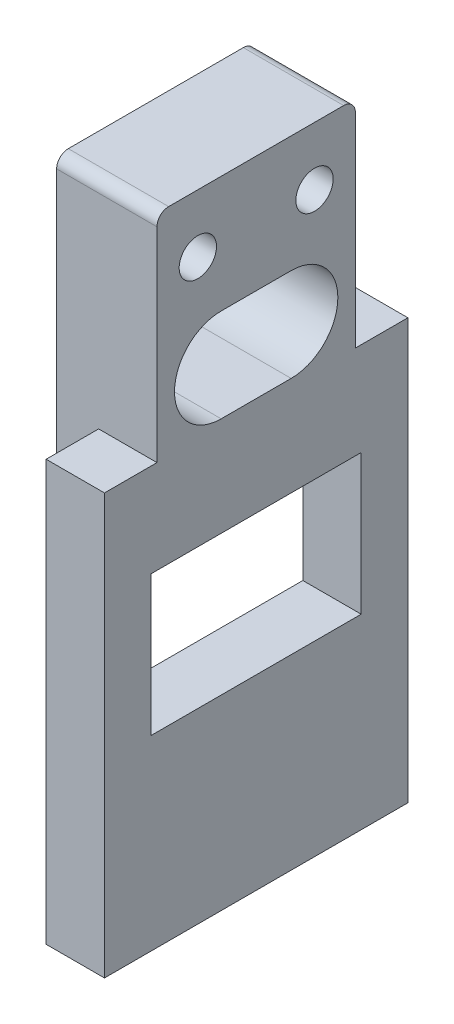
ISO-10303-21;
HEADER;
FILE_DESCRIPTION(('STEP AP214'),'2;1');
FILE_NAME('part.step','',(''),(''),'','','');
FILE_SCHEMA(('AUTOMOTIVE_DESIGN { 1 0 10303 214 1 1 1 1 }'));
ENDSEC;
DATA;
#1=APPLICATION_CONTEXT('core data for automotive mechanical design processes');
#2=APPLICATION_PROTOCOL_DEFINITION('international standard','automotive_design',2000,#1);
#3=PRODUCT_CONTEXT('',#1,'mechanical');
#4=PRODUCT('Part','Part','',(#3));
#5=PRODUCT_RELATED_PRODUCT_CATEGORY('part','',(#4));
#6=PRODUCT_DEFINITION_FORMATION('','',#4);
#7=PRODUCT_DEFINITION_CONTEXT('part definition',#1,'design');
#8=PRODUCT_DEFINITION('design','',#6,#7);
#9=PRODUCT_DEFINITION_SHAPE('','',#8);
#10=(LENGTH_UNIT() NAMED_UNIT(*) SI_UNIT(.MILLI.,.METRE.));
#11=(NAMED_UNIT(*) PLANE_ANGLE_UNIT() SI_UNIT($,.RADIAN.));
#12=(NAMED_UNIT(*) SI_UNIT($,.STERADIAN.) SOLID_ANGLE_UNIT());
#13=UNCERTAINTY_MEASURE_WITH_UNIT(LENGTH_MEASURE(1.E-05),#10,'distance_accuracy_value','');
#14=(GEOMETRIC_REPRESENTATION_CONTEXT(3) GLOBAL_UNCERTAINTY_ASSIGNED_CONTEXT((#13)) GLOBAL_UNIT_ASSIGNED_CONTEXT((#10,
#11,#12)) REPRESENTATION_CONTEXT('',''));
#15=CARTESIAN_POINT('',(0.,0.,0.));
#16=DIRECTION('',(0.,0.,1.));
#17=DIRECTION('',(1.,0.,0.));
#18=AXIS2_PLACEMENT_3D('',#15,#16,#17);
#19=CARTESIAN_POINT('',(3.60000000000001,27.5,0.));
#20=DIRECTION('',(0.,1.,0.));
#21=DIRECTION('',(0.,0.,1.));
#22=AXIS2_PLACEMENT_3D('',#19,#20,#21);
#23=PLANE('',#22);
#24=DIRECTION('',(0.,0.,1.));
#25=VECTOR('',#24,1.);
#26=CARTESIAN_POINT('',(8.6,27.5,0.));
#27=LINE('',#26,#25);
#28=CARTESIAN_POINT('',(8.60000000000001,27.5,8.5));
#29=VERTEX_POINT('',#28);
#30=CARTESIAN_POINT('',(8.6,27.5,13.));
#31=VERTEX_POINT('',#30);
#32=EDGE_CURVE('E350',#29,#31,#27,.T.);
#33=ORIENTED_EDGE('',*,*,#32,.F.);
#34=DIRECTION('',(-1.,0.,0.));
#35=VECTOR('',#34,1.);
#36=CARTESIAN_POINT('',(8.60000000000001,27.5,8.5));
#37=LINE('',#36,#35);
#38=CARTESIAN_POINT('',(3.60000000000001,27.5,8.5));
#39=VERTEX_POINT('',#38);
#40=EDGE_CURVE('E278',#29,#39,#37,.T.);
#41=ORIENTED_EDGE('',*,*,#40,.T.);
#42=DIRECTION('',(0.,0.,1.));
#43=VECTOR('',#42,1.);
#44=CARTESIAN_POINT('',(3.60000000000001,27.5,0.));
#45=LINE('',#44,#43);
#46=CARTESIAN_POINT('',(3.60000000000001,27.5,13.));
#47=VERTEX_POINT('',#46);
#48=EDGE_CURVE('E318',#39,#47,#45,.T.);
#49=ORIENTED_EDGE('',*,*,#48,.T.);
#50=DIRECTION('',(1.,0.,0.));
#51=VECTOR('',#50,1.);
#52=CARTESIAN_POINT('',(3.60000000000001,27.5,13.));
#53=LINE('',#52,#51);
#54=EDGE_CURVE('E399',#47,#31,#53,.T.);
#55=ORIENTED_EDGE('',*,*,#54,.T.);
#56=EDGE_LOOP('',(#33,#41,#49,#55));
#57=FACE_BOUND('',#56,.T.);
#58=ADVANCED_FACE('F45',(#57),#23,.T.);
#59=CARTESIAN_POINT('',(3.60000000000001,19.5,0.));
#60=DIRECTION('',(0.,1.,0.));
#61=DIRECTION('',(0.,0.,1.));
#62=AXIS2_PLACEMENT_3D('',#59,#60,#61);
#63=PLANE('',#62);
#64=DIRECTION('',(0.,0.,1.));
#65=VECTOR('',#64,1.);
#66=CARTESIAN_POINT('',(8.6,19.5,0.));
#67=LINE('',#66,#65);
#68=CARTESIAN_POINT('',(8.6,19.5,-8.99999999999999));
#69=VERTEX_POINT('',#68);
#70=CARTESIAN_POINT('',(8.6,19.5,9.00000000000002));
#71=VERTEX_POINT('',#70);
#72=EDGE_CURVE('E362',#69,#71,#67,.T.);
#73=ORIENTED_EDGE('',*,*,#72,.T.);
#74=DIRECTION('',(1.,0.,0.));
#75=VECTOR('',#74,1.);
#76=CARTESIAN_POINT('',(3.60000000000001,19.5,9.00000000000002));
#77=LINE('',#76,#75);
#78=CARTESIAN_POINT('',(3.60000000000001,19.5,9.00000000000002));
#79=VERTEX_POINT('',#78);
#80=EDGE_CURVE('E377',#79,#71,#77,.T.);
#81=ORIENTED_EDGE('',*,*,#80,.F.);
#82=DIRECTION('',(0.,0.,1.));
#83=VECTOR('',#82,1.);
#84=CARTESIAN_POINT('',(3.60000000000001,19.5,0.));
#85=LINE('',#84,#83);
#86=CARTESIAN_POINT('',(3.60000000000001,19.5,-8.99999999999999));
#87=VERTEX_POINT('',#86);
#88=EDGE_CURVE('E331',#87,#79,#85,.T.);
#89=ORIENTED_EDGE('',*,*,#88,.F.);
#90=DIRECTION('',(1.,0.,0.));
#91=VECTOR('',#90,1.);
#92=CARTESIAN_POINT('',(3.60000000000001,19.5,-8.99999999999999));
#93=LINE('',#92,#91);
#94=EDGE_CURVE('E388',#87,#69,#93,.T.);
#95=ORIENTED_EDGE('',*,*,#94,.T.);
#96=EDGE_LOOP('',(#73,#81,#89,#95));
#97=FACE_BOUND('',#96,.T.);
#98=ADVANCED_FACE('F510',(#97),#63,.F.);
#99=CARTESIAN_POINT('',(3.60000000000001,0.,9.00000000000002));
#100=DIRECTION('',(0.,0.,1.));
#101=DIRECTION('',(0.,-1.,0.));
#102=AXIS2_PLACEMENT_3D('',#99,#100,#101);
#103=PLANE('',#102);
#104=DIRECTION('',(0.,-1.,0.));
#105=VECTOR('',#104,1.);
#106=CARTESIAN_POINT('',(8.6,0.,9.00000000000002));
#107=LINE('',#106,#105);
#108=CARTESIAN_POINT('',(8.6,7.50000000000001,9.00000000000002));
#109=VERTEX_POINT('',#108);
#110=EDGE_CURVE('E319',#71,#109,#107,.T.);
#111=ORIENTED_EDGE('',*,*,#110,.T.);
#112=DIRECTION('',(1.,0.,0.));
#113=VECTOR('',#112,1.);
#114=CARTESIAN_POINT('',(3.60000000000001,7.50000000000001,9.00000000000002));
#115=LINE('',#114,#113);
#116=CARTESIAN_POINT('',(3.60000000000001,7.50000000000001,9.00000000000002));
#117=VERTEX_POINT('',#116);
#118=EDGE_CURVE('E382',#117,#109,#115,.T.);
#119=ORIENTED_EDGE('',*,*,#118,.F.);
#120=DIRECTION('',(0.,-1.,0.));
#121=VECTOR('',#120,1.);
#122=CARTESIAN_POINT('',(3.60000000000001,0.,9.00000000000002));
#123=LINE('',#122,#121);
#124=EDGE_CURVE('E343',#79,#117,#123,.T.);
#125=ORIENTED_EDGE('',*,*,#124,.F.);
#126=ORIENTED_EDGE('',*,*,#80,.T.);
#127=EDGE_LOOP('',(#111,#119,#125,#126));
#128=FACE_BOUND('',#127,.T.);
#129=ADVANCED_FACE('F515',(#128),#103,.F.);
#130=CARTESIAN_POINT('',(3.60000000000001,7.50000000000001,0.));
#131=DIRECTION('',(0.,1.,0.));
#132=DIRECTION('',(0.,0.,1.));
#133=AXIS2_PLACEMENT_3D('',#130,#131,#132);
#134=PLANE('',#133);
#135=DIRECTION('',(0.,0.,1.));
#136=VECTOR('',#135,1.);
#137=CARTESIAN_POINT('',(8.6,7.50000000000001,0.));
#138=LINE('',#137,#136);
#139=CARTESIAN_POINT('',(8.6,7.50000000000001,-8.99999999999999));
#140=VERTEX_POINT('',#139);
#141=EDGE_CURVE('E370',#140,#109,#138,.T.);
#142=ORIENTED_EDGE('',*,*,#141,.F.);
#143=DIRECTION('',(1.,0.,0.));
#144=VECTOR('',#143,1.);
#145=CARTESIAN_POINT('',(3.60000000000001,7.50000000000001,-8.99999999999999));
#146=LINE('',#145,#144);
#147=CARTESIAN_POINT('',(3.60000000000001,7.50000000000001,-8.99999999999999));
#148=VERTEX_POINT('',#147);
#149=EDGE_CURVE('E385',#148,#140,#146,.T.);
#150=ORIENTED_EDGE('',*,*,#149,.F.);
#151=DIRECTION('',(0.,0.,1.));
#152=VECTOR('',#151,1.);
#153=CARTESIAN_POINT('',(3.60000000000001,7.50000000000001,0.));
#154=LINE('',#153,#152);
#155=EDGE_CURVE('E339',#148,#117,#154,.T.);
#156=ORIENTED_EDGE('',*,*,#155,.T.);
#157=ORIENTED_EDGE('',*,*,#118,.T.);
#158=EDGE_LOOP('',(#142,#150,#156,#157));
#159=FACE_BOUND('',#158,.T.);
#160=ADVANCED_FACE('F533',(#159),#134,.T.);
#161=CARTESIAN_POINT('',(3.60000000000001,0.,-13.));
#162=DIRECTION('',(0.,0.,1.));
#163=DIRECTION('',(0.,-1.,0.));
#164=AXIS2_PLACEMENT_3D('',#161,#162,#163);
#165=PLANE('',#164);
#166=DIRECTION('',(0.,-1.,0.));
#167=VECTOR('',#166,1.);
#168=CARTESIAN_POINT('',(8.6,0.,-13.));
#169=LINE('',#168,#167);
#170=CARTESIAN_POINT('',(8.6,27.5,-13.));
#171=VERTEX_POINT('',#170);
#172=CARTESIAN_POINT('',(8.6,-8.49999999999999,-13.));
#173=VERTEX_POINT('',#172);
#174=EDGE_CURVE('E313',#171,#173,#169,.T.);
#175=ORIENTED_EDGE('',*,*,#174,.T.);
#176=DIRECTION('',(1.,0.,0.));
#177=VECTOR('',#176,1.);
#178=CARTESIAN_POINT('',(3.60000000000001,-8.49999999999999,-13.));
#179=LINE('',#178,#177);
#180=CARTESIAN_POINT('',(3.60000000000001,-8.49999999999999,-13.));
#181=VERTEX_POINT('',#180);
#182=EDGE_CURVE('E391',#181,#173,#179,.T.);
#183=ORIENTED_EDGE('',*,*,#182,.F.);
#184=DIRECTION('',(0.,-1.,0.));
#185=VECTOR('',#184,1.);
#186=CARTESIAN_POINT('',(3.60000000000001,0.,-13.));
#187=LINE('',#186,#185);
#188=CARTESIAN_POINT('',(3.60000000000001,27.5,-13.));
#189=VERTEX_POINT('',#188);
#190=EDGE_CURVE('E314',#189,#181,#187,.T.);
#191=ORIENTED_EDGE('',*,*,#190,.F.);
#192=DIRECTION('',(1.,0.,0.));
#193=VECTOR('',#192,1.);
#194=CARTESIAN_POINT('',(3.60000000000001,27.5,-13.));
#195=LINE('',#194,#193);
#196=EDGE_CURVE('E346',#189,#171,#195,.T.);
#197=ORIENTED_EDGE('',*,*,#196,.T.);
#198=EDGE_LOOP('',(#175,#183,#191,#197));
#199=FACE_BOUND('',#198,.T.);
#200=ADVANCED_FACE('F497',(#199),#165,.F.);
#201=CARTESIAN_POINT('',(3.60000000000001,-8.49999999999999,0.));
#202=DIRECTION('',(0.,1.,0.));
#203=DIRECTION('',(0.,0.,1.));
#204=AXIS2_PLACEMENT_3D('',#201,#202,#203);
#205=PLANE('',#204);
#206=DIRECTION('',(0.,0.,1.));
#207=VECTOR('',#206,1.);
#208=CARTESIAN_POINT('',(8.6,-8.49999999999999,0.));
#209=LINE('',#208,#207);
#210=CARTESIAN_POINT('',(8.6,-8.49999999999998,13.));
#211=VERTEX_POINT('',#210);
#212=EDGE_CURVE('E359',#173,#211,#209,.T.);
#213=ORIENTED_EDGE('',*,*,#212,.T.);
#214=DIRECTION('',(1.,0.,0.));
#215=VECTOR('',#214,1.);
#216=CARTESIAN_POINT('',(3.60000000000001,-8.49999999999998,13.));
#217=LINE('',#216,#215);
#218=CARTESIAN_POINT('',(3.60000000000001,-8.49999999999998,13.));
#219=VERTEX_POINT('',#218);
#220=EDGE_CURVE('E395',#219,#211,#217,.T.);
#221=ORIENTED_EDGE('',*,*,#220,.F.);
#222=DIRECTION('',(0.,0.,1.));
#223=VECTOR('',#222,1.);
#224=CARTESIAN_POINT('',(3.60000000000001,-8.49999999999999,0.));
#225=LINE('',#224,#223);
#226=EDGE_CURVE('E328',#181,#219,#225,.T.);
#227=ORIENTED_EDGE('',*,*,#226,.F.);
#228=ORIENTED_EDGE('',*,*,#182,.T.);
#229=EDGE_LOOP('',(#213,#221,#227,#228));
#230=FACE_BOUND('',#229,.T.);
#231=ADVANCED_FACE('F499',(#230),#205,.F.);
#232=CARTESIAN_POINT('',(3.60000000000001,0.,13.));
#233=DIRECTION('',(0.,0.,-1.));
#234=DIRECTION('',(0.,1.,0.));
#235=AXIS2_PLACEMENT_3D('',#232,#233,#234);
#236=PLANE('',#235);
#237=DIRECTION('',(0.,1.,0.));
#238=VECTOR('',#237,1.);
#239=CARTESIAN_POINT('',(8.6,0.,13.));
#240=LINE('',#239,#238);
#241=EDGE_CURVE('E355',#211,#31,#240,.T.);
#242=ORIENTED_EDGE('',*,*,#241,.T.);
#243=ORIENTED_EDGE('',*,*,#54,.F.);
#244=DIRECTION('',(0.,1.,0.));
#245=VECTOR('',#244,1.);
#246=CARTESIAN_POINT('',(3.60000000000001,0.,13.));
#247=LINE('',#246,#245);
#248=EDGE_CURVE('E324',#219,#47,#247,.T.);
#249=ORIENTED_EDGE('',*,*,#248,.F.);
#250=ORIENTED_EDGE('',*,*,#220,.T.);
#251=EDGE_LOOP('',(#242,#243,#249,#250));
#252=FACE_BOUND('',#251,.T.);
#253=ADVANCED_FACE('F504',(#252),#236,.F.);
#254=DIRECTION('',(-1.,0.,0.));
#255=VECTOR('',#254,1.);
#256=CARTESIAN_POINT('',(8.60000000000001,27.5,-8.49999999999997));
#257=LINE('',#256,#255);
#258=CARTESIAN_POINT('',(8.60000000000001,27.5,-8.49999999999997));
#259=VERTEX_POINT('',#258);
#260=CARTESIAN_POINT('',(3.60000000000001,27.5,-8.49999999999997));
#261=VERTEX_POINT('',#260);
#262=EDGE_CURVE('E274',#259,#261,#257,.T.);
#263=ORIENTED_EDGE('',*,*,#262,.F.);
#264=EDGE_CURVE('E351',#171,#259,#27,.T.);
#265=ORIENTED_EDGE('',*,*,#264,.F.);
#266=ORIENTED_EDGE('',*,*,#196,.F.);
#267=EDGE_CURVE('E320',#189,#261,#45,.T.);
#268=ORIENTED_EDGE('',*,*,#267,.T.);
#269=EDGE_LOOP('',(#263,#265,#266,#268));
#270=FACE_BOUND('',#269,.T.);
#271=ADVANCED_FACE('F492',(#270),#23,.T.);
#272=CARTESIAN_POINT('',(3.60000000000001,0.,-8.99999999999999));
#273=DIRECTION('',(0.,0.,1.));
#274=DIRECTION('',(0.,-1.,0.));
#275=AXIS2_PLACEMENT_3D('',#272,#273,#274);
#276=PLANE('',#275);
#277=DIRECTION('',(0.,-1.,0.));
#278=VECTOR('',#277,1.);
#279=CARTESIAN_POINT('',(8.6,0.,-8.99999999999999));
#280=LINE('',#279,#278);
#281=EDGE_CURVE('E366',#69,#140,#280,.T.);
#282=ORIENTED_EDGE('',*,*,#281,.F.);
#283=ORIENTED_EDGE('',*,*,#94,.F.);
#284=DIRECTION('',(0.,-1.,0.));
#285=VECTOR('',#284,1.);
#286=CARTESIAN_POINT('',(3.60000000000001,0.,-8.99999999999999));
#287=LINE('',#286,#285);
#288=EDGE_CURVE('E335',#87,#148,#287,.T.);
#289=ORIENTED_EDGE('',*,*,#288,.T.);
#290=ORIENTED_EDGE('',*,*,#149,.T.);
#291=EDGE_LOOP('',(#282,#283,#289,#290));
#292=FACE_BOUND('',#291,.T.);
#293=ADVANCED_FACE('F521',(#292),#276,.T.);
#294=CARTESIAN_POINT('',(3.60000000000001,0.,0.));
#295=DIRECTION('',(1.,0.,0.));
#296=DIRECTION('',(0.,0.,-1.));
#297=AXIS2_PLACEMENT_3D('',#294,#295,#296);
#298=PLANE('',#297);
#299=ORIENTED_EDGE('',*,*,#48,.F.);
#300=DIRECTION('',(0.,-1.,0.));
#301=VECTOR('',#300,1.);
#302=CARTESIAN_POINT('',(3.60000000000001,0.,8.5));
#303=LINE('',#302,#301);
#304=CARTESIAN_POINT('',(3.60000000000001,23.5,8.5));
#305=VERTEX_POINT('',#304);
#306=EDGE_CURVE('E310',#39,#305,#303,.T.);
#307=ORIENTED_EDGE('',*,*,#306,.T.);
#308=CARTESIAN_POINT('',(3.60000000000001,23.5,7.5));
#309=DIRECTION('',(1.,0.,0.));
#310=DIRECTION('',(0.,0.,-1.));
#311=AXIS2_PLACEMENT_3D('',#308,#309,#310);
#312=CIRCLE('',#311,1.);
#313=CARTESIAN_POINT('',(3.60000000000001,22.5,7.5));
#314=VERTEX_POINT('',#313);
#315=EDGE_CURVE('E11',#305,#314,#312,.T.);
#316=ORIENTED_EDGE('',*,*,#315,.T.);
#317=DIRECTION('',(0.,0.,-1.));
#318=VECTOR('',#317,1.);
#319=CARTESIAN_POINT('',(3.60000000000001,22.5,0.));
#320=LINE('',#319,#318);
#321=CARTESIAN_POINT('',(3.60000000000001,22.5,-7.49999999999997));
#322=VERTEX_POINT('',#321);
#323=EDGE_CURVE('E307',#314,#322,#320,.T.);
#324=ORIENTED_EDGE('',*,*,#323,.T.);
#325=CARTESIAN_POINT('',(3.60000000000001,23.5,-7.49999999999997));
#326=DIRECTION('',(1.,0.,0.));
#327=DIRECTION('',(0.,0.,-1.));
#328=AXIS2_PLACEMENT_3D('',#325,#326,#327);
#329=CIRCLE('',#328,1.);
#330=CARTESIAN_POINT('',(3.60000000000001,23.5,-8.49999999999997));
#331=VERTEX_POINT('',#330);
#332=EDGE_CURVE('E54',#322,#331,#329,.T.);
#333=ORIENTED_EDGE('',*,*,#332,.T.);
#334=DIRECTION('',(0.,1.,0.));
#335=VECTOR('',#334,1.);
#336=CARTESIAN_POINT('',(3.60000000000001,0.,-8.49999999999996));
#337=LINE('',#336,#335);
#338=EDGE_CURVE('E304',#331,#261,#337,.T.);
#339=ORIENTED_EDGE('',*,*,#338,.T.);
#340=ORIENTED_EDGE('',*,*,#267,.F.);
#341=ORIENTED_EDGE('',*,*,#190,.T.);
#342=ORIENTED_EDGE('',*,*,#226,.T.);
#343=ORIENTED_EDGE('',*,*,#248,.T.);
#344=EDGE_LOOP('',(#299,#307,#316,#324,#333,#339,#340,#341,#342,#343));
#345=FACE_BOUND('',#344,.T.);
#346=ORIENTED_EDGE('',*,*,#88,.T.);
#347=ORIENTED_EDGE('',*,*,#124,.T.);
#348=ORIENTED_EDGE('',*,*,#155,.F.);
#349=ORIENTED_EDGE('',*,*,#288,.F.);
#350=EDGE_LOOP('',(#346,#347,#348,#349));
#351=FACE_BOUND('',#350,.T.);
#352=ADVANCED_FACE('F452',(#345,#351),#298,.F.);
#353=CARTESIAN_POINT('',(8.6,0.,0.));
#354=DIRECTION('',(1.,0.,0.));
#355=DIRECTION('',(0.,0.,-1.));
#356=AXIS2_PLACEMENT_3D('',#353,#354,#355);
#357=PLANE('',#356);
#358=CARTESIAN_POINT('',(8.6,41.,5.00000000000001));
#359=DIRECTION('',(1.,0.,0.));
#360=DIRECTION('',(0.,0.,-1.));
#361=AXIS2_PLACEMENT_3D('',#358,#359,#360);
#362=CIRCLE('',#361,1.59999999999999);
#363=CARTESIAN_POINT('',(8.6,41.,3.40000000000002));
#364=VERTEX_POINT('',#363);
#365=EDGE_CURVE('E214',#364,#364,#362,.T.);
#366=ORIENTED_EDGE('',*,*,#365,.F.);
#367=EDGE_LOOP('',(#366));
#368=FACE_BOUND('',#367,.T.);
#369=CARTESIAN_POINT('',(8.6,41.,-4.99999999999999));
#370=DIRECTION('',(1.,0.,0.));
#371=DIRECTION('',(0.,0.,-1.));
#372=AXIS2_PLACEMENT_3D('',#369,#370,#371);
#373=CIRCLE('',#372,1.59999999999999);
#374=CARTESIAN_POINT('',(8.6,41.,-6.59999999999998));
#375=VERTEX_POINT('',#374);
#376=EDGE_CURVE('E213',#375,#375,#373,.T.);
#377=ORIENTED_EDGE('',*,*,#376,.F.);
#378=EDGE_LOOP('',(#377));
#379=FACE_BOUND('',#378,.T.);
#380=DIRECTION('',(0.,-1.,0.));
#381=VECTOR('',#380,1.);
#382=CARTESIAN_POINT('',(8.60000000000001,0.,-8.49999999999996));
#383=LINE('',#382,#381);
#384=CARTESIAN_POINT('',(8.60000000000001,45.,-8.49999999999997));
#385=VERTEX_POINT('',#384);
#386=EDGE_CURVE('E252',#385,#259,#383,.T.);
#387=ORIENTED_EDGE('',*,*,#386,.F.);
#388=CARTESIAN_POINT('',(8.6,45.,-7.49999999999997));
#389=DIRECTION('',(1.,0.,0.));
#390=DIRECTION('',(0.,0.,-1.));
#391=AXIS2_PLACEMENT_3D('',#388,#389,#390);
#392=CIRCLE('',#391,1.);
#393=CARTESIAN_POINT('',(8.60000000000001,46.,-7.49999999999997));
#394=VERTEX_POINT('',#393);
#395=EDGE_CURVE('E433',#385,#394,#392,.T.);
#396=ORIENTED_EDGE('',*,*,#395,.T.);
#397=DIRECTION('',(0.,0.,-1.));
#398=VECTOR('',#397,1.);
#399=CARTESIAN_POINT('',(8.60000000000001,46.,0.));
#400=LINE('',#399,#398);
#401=CARTESIAN_POINT('',(8.60000000000001,46.,7.5));
#402=VERTEX_POINT('',#401);
#403=EDGE_CURVE('E244',#402,#394,#400,.T.);
#404=ORIENTED_EDGE('',*,*,#403,.F.);
#405=CARTESIAN_POINT('',(8.6,45.,7.5));
#406=DIRECTION('',(1.,0.,0.));
#407=DIRECTION('',(0.,0.,-1.));
#408=AXIS2_PLACEMENT_3D('',#405,#406,#407);
#409=CIRCLE('',#408,1.);
#410=CARTESIAN_POINT('',(8.60000000000001,45.,8.5));
#411=VERTEX_POINT('',#410);
#412=EDGE_CURVE('E430',#402,#411,#409,.T.);
#413=ORIENTED_EDGE('',*,*,#412,.T.);
#414=DIRECTION('',(0.,1.,0.));
#415=VECTOR('',#414,1.);
#416=CARTESIAN_POINT('',(8.60000000000001,0.,8.5));
#417=LINE('',#416,#415);
#418=EDGE_CURVE('E248',#29,#411,#417,.T.);
#419=ORIENTED_EDGE('',*,*,#418,.F.);
#420=ORIENTED_EDGE('',*,*,#32,.T.);
#421=ORIENTED_EDGE('',*,*,#241,.F.);
#422=ORIENTED_EDGE('',*,*,#212,.F.);
#423=ORIENTED_EDGE('',*,*,#174,.F.);
#424=ORIENTED_EDGE('',*,*,#264,.T.);
#425=EDGE_LOOP('',(#387,#396,#404,#413,#419,#420,#421,#422,#423,#424));
#426=FACE_BOUND('',#425,.T.);
#427=ORIENTED_EDGE('',*,*,#72,.F.);
#428=ORIENTED_EDGE('',*,*,#281,.T.);
#429=ORIENTED_EDGE('',*,*,#141,.T.);
#430=ORIENTED_EDGE('',*,*,#110,.F.);
#431=EDGE_LOOP('',(#427,#428,#429,#430));
#432=FACE_BOUND('',#431,.T.);
#433=CARTESIAN_POINT('',(8.60000000000001,32.,3.00000000000001));
#434=DIRECTION('',(1.,0.,0.));
#435=DIRECTION('',(0.,0.,-1.));
#436=AXIS2_PLACEMENT_3D('',#433,#434,#435);
#437=CIRCLE('',#436,4.);
#438=CARTESIAN_POINT('',(8.60000000000001,36.,3.00000000000001));
#439=VERTEX_POINT('',#438);
#440=CARTESIAN_POINT('',(8.60000000000001,28.,3.00000000000001));
#441=VERTEX_POINT('',#440);
#442=EDGE_CURVE('E228',#439,#441,#437,.T.);
#443=ORIENTED_EDGE('',*,*,#442,.F.);
#444=DIRECTION('',(0.,0.,-1.));
#445=VECTOR('',#444,1.);
#446=CARTESIAN_POINT('',(8.60000000000001,36.,0.));
#447=LINE('',#446,#445);
#448=CARTESIAN_POINT('',(8.60000000000001,36.,-2.99999999999999));
#449=VERTEX_POINT('',#448);
#450=EDGE_CURVE('E232',#439,#449,#447,.T.);
#451=ORIENTED_EDGE('',*,*,#450,.T.);
#452=CARTESIAN_POINT('',(8.60000000000001,32.,-2.99999999999999));
#453=DIRECTION('',(1.,0.,0.));
#454=DIRECTION('',(0.,0.,-1.));
#455=AXIS2_PLACEMENT_3D('',#452,#453,#454);
#456=CIRCLE('',#455,4.);
#457=CARTESIAN_POINT('',(8.60000000000001,28.,-2.99999999999999));
#458=VERTEX_POINT('',#457);
#459=EDGE_CURVE('E236',#458,#449,#456,.T.);
#460=ORIENTED_EDGE('',*,*,#459,.F.);
#461=DIRECTION('',(0.,0.,-1.));
#462=VECTOR('',#461,1.);
#463=CARTESIAN_POINT('',(8.60000000000001,28.,0.));
#464=LINE('',#463,#462);
#465=EDGE_CURVE('E240',#441,#458,#464,.T.);
#466=ORIENTED_EDGE('',*,*,#465,.F.);
#467=EDGE_LOOP('',(#443,#451,#460,#466));
#468=FACE_BOUND('',#467,.T.);
#469=ADVANCED_FACE('F487',(#368,#379,#426,#432,#468),#357,.T.);
#470=CARTESIAN_POINT('',(8.60000000000001,0.,8.5));
#471=DIRECTION('',(0.,0.,1.));
#472=DIRECTION('',(1.,0.,0.));
#473=AXIS2_PLACEMENT_3D('',#470,#471,#472);
#474=PLANE('',#473);
#475=DIRECTION('',(0.,1.,0.));
#476=VECTOR('',#475,1.);
#477=CARTESIAN_POINT('',(0.,0.,8.5));
#478=LINE('',#477,#476);
#479=CARTESIAN_POINT('',(0.,23.5,8.5));
#480=VERTEX_POINT('',#479);
#481=CARTESIAN_POINT('',(0.,45.,8.5));
#482=VERTEX_POINT('',#481);
#483=EDGE_CURVE('E282',#480,#482,#478,.T.);
#484=ORIENTED_EDGE('',*,*,#483,.F.);
#485=DIRECTION('',(-1.,0.,0.));
#486=VECTOR('',#485,1.);
#487=CARTESIAN_POINT('',(8.60000000000001,23.5,8.5));
#488=LINE('',#487,#486);
#489=EDGE_CURVE('E61',#480,#305,#488,.F.);
#490=ORIENTED_EDGE('',*,*,#489,.T.);
#491=ORIENTED_EDGE('',*,*,#306,.F.);
#492=ORIENTED_EDGE('',*,*,#40,.F.);
#493=ORIENTED_EDGE('',*,*,#418,.T.);
#494=DIRECTION('',(-1.,0.,0.));
#495=VECTOR('',#494,1.);
#496=CARTESIAN_POINT('',(8.60000000000001,45.,8.5));
#497=LINE('',#496,#495);
#498=EDGE_CURVE('E442',#411,#482,#497,.T.);
#499=ORIENTED_EDGE('',*,*,#498,.T.);
#500=EDGE_LOOP('',(#484,#490,#491,#492,#493,#499));
#501=FACE_BOUND('',#500,.T.);
#502=ADVANCED_FACE('F470',(#501),#474,.T.);
#503=CARTESIAN_POINT('',(8.60000000000001,22.5,0.));
#504=DIRECTION('',(0.,-1.,0.));
#505=DIRECTION('',(0.,0.,-1.));
#506=AXIS2_PLACEMENT_3D('',#503,#504,#505);
#507=PLANE('',#506);
#508=DIRECTION('',(0.,0.,1.));
#509=VECTOR('',#508,1.);
#510=CARTESIAN_POINT('',(0.,22.5,0.));
#511=LINE('',#510,#509);
#512=CARTESIAN_POINT('',(0.,22.5,-7.49999999999997));
#513=VERTEX_POINT('',#512);
#514=CARTESIAN_POINT('',(0.,22.5,7.5));
#515=VERTEX_POINT('',#514);
#516=EDGE_CURVE('E296',#513,#515,#511,.T.);
#517=ORIENTED_EDGE('',*,*,#516,.F.);
#518=DIRECTION('',(-1.,0.,0.));
#519=VECTOR('',#518,1.);
#520=CARTESIAN_POINT('',(8.60000000000001,22.5,-7.49999999999997));
#521=LINE('',#520,#519);
#522=EDGE_CURVE('E69',#513,#322,#521,.F.);
#523=ORIENTED_EDGE('',*,*,#522,.T.);
#524=ORIENTED_EDGE('',*,*,#323,.F.);
#525=DIRECTION('',(-1.,0.,0.));
#526=VECTOR('',#525,1.);
#527=CARTESIAN_POINT('',(8.60000000000001,22.5,7.5));
#528=LINE('',#527,#526);
#529=EDGE_CURVE('E436',#314,#515,#528,.T.);
#530=ORIENTED_EDGE('',*,*,#529,.T.);
#531=EDGE_LOOP('',(#517,#523,#524,#530));
#532=FACE_BOUND('',#531,.T.);
#533=ADVANCED_FACE('F465',(#532),#507,.T.);
#534=CARTESIAN_POINT('',(8.60000000000001,0.,-8.49999999999996));
#535=DIRECTION('',(0.,0.,-1.));
#536=DIRECTION('',(0.,1.,0.));
#537=AXIS2_PLACEMENT_3D('',#534,#535,#536);
#538=PLANE('',#537);
#539=DIRECTION('',(0.,-1.,0.));
#540=VECTOR('',#539,1.);
#541=CARTESIAN_POINT('',(0.,0.,-8.49999999999996));
#542=LINE('',#541,#540);
#543=CARTESIAN_POINT('',(0.,45.,-8.49999999999997));
#544=VERTEX_POINT('',#543);
#545=CARTESIAN_POINT('',(0.,23.5,-8.49999999999997));
#546=VERTEX_POINT('',#545);
#547=EDGE_CURVE('E300',#544,#546,#542,.T.);
#548=ORIENTED_EDGE('',*,*,#547,.F.);
#549=DIRECTION('',(-1.,0.,0.));
#550=VECTOR('',#549,1.);
#551=CARTESIAN_POINT('',(8.60000000000001,45.,-8.49999999999997));
#552=LINE('',#551,#550);
#553=EDGE_CURVE('E427',#544,#385,#552,.F.);
#554=ORIENTED_EDGE('',*,*,#553,.T.);
#555=ORIENTED_EDGE('',*,*,#386,.T.);
#556=ORIENTED_EDGE('',*,*,#262,.T.);
#557=ORIENTED_EDGE('',*,*,#338,.F.);
#558=DIRECTION('',(-1.,0.,0.));
#559=VECTOR('',#558,1.);
#560=CARTESIAN_POINT('',(8.60000000000001,23.5,-8.49999999999997));
#561=LINE('',#560,#559);
#562=EDGE_CURVE('E423',#331,#546,#561,.T.);
#563=ORIENTED_EDGE('',*,*,#562,.T.);
#564=EDGE_LOOP('',(#548,#554,#555,#556,#557,#563));
#565=FACE_BOUND('',#564,.T.);
#566=ADVANCED_FACE('F459',(#565),#538,.T.);
#567=CARTESIAN_POINT('',(0.,0.,0.));
#568=DIRECTION('',(1.,0.,0.));
#569=DIRECTION('',(0.,0.,-1.));
#570=AXIS2_PLACEMENT_3D('',#567,#568,#569);
#571=PLANE('',#570);
#572=DIRECTION('',(0.,0.,-1.));
#573=VECTOR('',#572,1.);
#574=CARTESIAN_POINT('',(0.,46.,0.));
#575=LINE('',#574,#573);
#576=CARTESIAN_POINT('',(0.,46.,7.5));
#577=VERTEX_POINT('',#576);
#578=CARTESIAN_POINT('',(0.,46.,-7.49999999999997));
#579=VERTEX_POINT('',#578);
#580=EDGE_CURVE('E233',#577,#579,#575,.T.);
#581=ORIENTED_EDGE('',*,*,#580,.T.);
#582=CARTESIAN_POINT('',(0.,45.,-7.49999999999997));
#583=DIRECTION('',(1.,0.,0.));
#584=DIRECTION('',(0.,0.,-1.));
#585=AXIS2_PLACEMENT_3D('',#582,#583,#584);
#586=CIRCLE('',#585,1.);
#587=EDGE_CURVE('E420',#579,#544,#586,.F.);
#588=ORIENTED_EDGE('',*,*,#587,.T.);
#589=ORIENTED_EDGE('',*,*,#547,.T.);
#590=CARTESIAN_POINT('',(0.,23.5,-7.49999999999997));
#591=DIRECTION('',(1.,0.,0.));
#592=DIRECTION('',(0.,0.,-1.));
#593=AXIS2_PLACEMENT_3D('',#590,#591,#592);
#594=CIRCLE('',#593,1.);
#595=EDGE_CURVE('E417',#546,#513,#594,.F.);
#596=ORIENTED_EDGE('',*,*,#595,.T.);
#597=ORIENTED_EDGE('',*,*,#516,.T.);
#598=CARTESIAN_POINT('',(0.,23.5,7.5));
#599=DIRECTION('',(1.,0.,0.));
#600=DIRECTION('',(0.,0.,-1.));
#601=AXIS2_PLACEMENT_3D('',#598,#599,#600);
#602=CIRCLE('',#601,1.);
#603=EDGE_CURVE('E414',#515,#480,#602,.F.);
#604=ORIENTED_EDGE('',*,*,#603,.T.);
#605=ORIENTED_EDGE('',*,*,#483,.T.);
#606=CARTESIAN_POINT('',(0.,45.,7.5));
#607=DIRECTION('',(1.,0.,0.));
#608=DIRECTION('',(0.,0.,-1.));
#609=AXIS2_PLACEMENT_3D('',#606,#607,#608);
#610=CIRCLE('',#609,1.);
#611=EDGE_CURVE('E411',#482,#577,#610,.F.);
#612=ORIENTED_EDGE('',*,*,#611,.T.);
#613=EDGE_LOOP('',(#581,#588,#589,#596,#597,#604,#605,#612));
#614=FACE_BOUND('',#613,.T.);
#615=CARTESIAN_POINT('',(0.,32.,3.00000000000001));
#616=DIRECTION('',(1.,0.,0.));
#617=DIRECTION('',(0.,0.,-1.));
#618=AXIS2_PLACEMENT_3D('',#615,#616,#617);
#619=CIRCLE('',#618,4.);
#620=CARTESIAN_POINT('',(0.,36.,3.00000000000001));
#621=VERTEX_POINT('',#620);
#622=CARTESIAN_POINT('',(0.,28.,3.00000000000001));
#623=VERTEX_POINT('',#622);
#624=EDGE_CURVE('E227',#621,#623,#619,.T.);
#625=ORIENTED_EDGE('',*,*,#624,.T.);
#626=DIRECTION('',(0.,0.,-1.));
#627=VECTOR('',#626,1.);
#628=CARTESIAN_POINT('',(0.,28.,0.));
#629=LINE('',#628,#627);
#630=CARTESIAN_POINT('',(0.,28.,-2.99999999999999));
#631=VERTEX_POINT('',#630);
#632=EDGE_CURVE('E267',#623,#631,#629,.T.);
#633=ORIENTED_EDGE('',*,*,#632,.T.);
#634=CARTESIAN_POINT('',(0.,32.,-2.99999999999999));
#635=DIRECTION('',(1.,0.,0.));
#636=DIRECTION('',(0.,0.,-1.));
#637=AXIS2_PLACEMENT_3D('',#634,#635,#636);
#638=CIRCLE('',#637,4.);
#639=CARTESIAN_POINT('',(0.,36.,-2.99999999999999));
#640=VERTEX_POINT('',#639);
#641=EDGE_CURVE('E263',#631,#640,#638,.T.);
#642=ORIENTED_EDGE('',*,*,#641,.T.);
#643=DIRECTION('',(0.,0.,-1.));
#644=VECTOR('',#643,1.);
#645=CARTESIAN_POINT('',(0.,36.,0.));
#646=LINE('',#645,#644);
#647=EDGE_CURVE('E259',#621,#640,#646,.T.);
#648=ORIENTED_EDGE('',*,*,#647,.F.);
#649=EDGE_LOOP('',(#625,#633,#642,#648));
#650=FACE_BOUND('',#649,.T.);
#651=ADVANCED_FACE('F463',(#614,#650),#571,.F.);
#652=CARTESIAN_POINT('',(8.60000000000001,46.,0.));
#653=DIRECTION('',(0.,1.,0.));
#654=DIRECTION('',(0.,0.,1.));
#655=AXIS2_PLACEMENT_3D('',#652,#653,#654);
#656=PLANE('',#655);
#657=ORIENTED_EDGE('',*,*,#403,.T.);
#658=DIRECTION('',(-1.,0.,0.));
#659=VECTOR('',#658,1.);
#660=CARTESIAN_POINT('',(8.60000000000001,46.,-7.49999999999997));
#661=LINE('',#660,#659);
#662=EDGE_CURVE('E407',#394,#579,#661,.T.);
#663=ORIENTED_EDGE('',*,*,#662,.T.);
#664=ORIENTED_EDGE('',*,*,#580,.F.);
#665=DIRECTION('',(-1.,0.,0.));
#666=VECTOR('',#665,1.);
#667=CARTESIAN_POINT('',(8.60000000000001,46.,7.5));
#668=LINE('',#667,#666);
#669=EDGE_CURVE('E381',#577,#402,#668,.F.);
#670=ORIENTED_EDGE('',*,*,#669,.T.);
#671=EDGE_LOOP('',(#657,#663,#664,#670));
#672=FACE_BOUND('',#671,.T.);
#673=ADVANCED_FACE('F478',(#672),#656,.T.);
#674=CARTESIAN_POINT('',(8.60000000000001,32.,3.00000000000001));
#675=DIRECTION('',(-1.,0.,0.));
#676=DIRECTION('',(0.,0.,1.));
#677=AXIS2_PLACEMENT_3D('',#674,#675,#676);
#678=CYLINDRICAL_SURFACE('',#677,4.);
#679=ORIENTED_EDGE('',*,*,#624,.F.);
#680=DIRECTION('',(-1.,0.,0.));
#681=VECTOR('',#680,1.);
#682=CARTESIAN_POINT('',(8.60000000000001,36.,3.00000000000001));
#683=LINE('',#682,#681);
#684=EDGE_CURVE('E279',#439,#621,#683,.T.);
#685=ORIENTED_EDGE('',*,*,#684,.F.);
#686=ORIENTED_EDGE('',*,*,#442,.T.);
#687=DIRECTION('',(-1.,0.,0.));
#688=VECTOR('',#687,1.);
#689=CARTESIAN_POINT('',(8.60000000000001,28.,3.00000000000001));
#690=LINE('',#689,#688);
#691=EDGE_CURVE('E255',#441,#623,#690,.T.);
#692=ORIENTED_EDGE('',*,*,#691,.T.);
#693=EDGE_LOOP('',(#679,#685,#686,#692));
#694=FACE_BOUND('',#693,.T.);
#695=ADVANCED_FACE('F553',(#694),#678,.F.);
#696=CARTESIAN_POINT('',(8.60000000000001,36.,0.));
#697=DIRECTION('',(0.,1.,0.));
#698=DIRECTION('',(0.,0.,1.));
#699=AXIS2_PLACEMENT_3D('',#696,#697,#698);
#700=PLANE('',#699);
#701=ORIENTED_EDGE('',*,*,#647,.T.);
#702=DIRECTION('',(-1.,0.,0.));
#703=VECTOR('',#702,1.);
#704=CARTESIAN_POINT('',(8.60000000000001,36.,-2.99999999999999));
#705=LINE('',#704,#703);
#706=EDGE_CURVE('E288',#449,#640,#705,.T.);
#707=ORIENTED_EDGE('',*,*,#706,.F.);
#708=ORIENTED_EDGE('',*,*,#450,.F.);
#709=ORIENTED_EDGE('',*,*,#684,.T.);
#710=EDGE_LOOP('',(#701,#707,#708,#709));
#711=FACE_BOUND('',#710,.T.);
#712=ADVANCED_FACE('F556',(#711),#700,.F.);
#713=CARTESIAN_POINT('',(8.60000000000001,32.,-2.99999999999999));
#714=DIRECTION('',(-1.,0.,0.));
#715=DIRECTION('',(0.,0.,1.));
#716=AXIS2_PLACEMENT_3D('',#713,#714,#715);
#717=CYLINDRICAL_SURFACE('',#716,4.);
#718=ORIENTED_EDGE('',*,*,#641,.F.);
#719=DIRECTION('',(-1.,0.,0.));
#720=VECTOR('',#719,1.);
#721=CARTESIAN_POINT('',(8.60000000000001,28.,-2.99999999999999));
#722=LINE('',#721,#720);
#723=EDGE_CURVE('E285',#458,#631,#722,.T.);
#724=ORIENTED_EDGE('',*,*,#723,.F.);
#725=ORIENTED_EDGE('',*,*,#459,.T.);
#726=ORIENTED_EDGE('',*,*,#706,.T.);
#727=EDGE_LOOP('',(#718,#724,#725,#726));
#728=FACE_BOUND('',#727,.T.);
#729=ADVANCED_FACE('F560',(#728),#717,.F.);
#730=CARTESIAN_POINT('',(8.60000000000001,28.,0.));
#731=DIRECTION('',(0.,1.,0.));
#732=DIRECTION('',(0.,0.,1.));
#733=AXIS2_PLACEMENT_3D('',#730,#731,#732);
#734=PLANE('',#733);
#735=ORIENTED_EDGE('',*,*,#632,.F.);
#736=ORIENTED_EDGE('',*,*,#691,.F.);
#737=ORIENTED_EDGE('',*,*,#465,.T.);
#738=ORIENTED_EDGE('',*,*,#723,.T.);
#739=EDGE_LOOP('',(#735,#736,#737,#738));
#740=FACE_BOUND('',#739,.T.);
#741=ADVANCED_FACE('F564',(#740),#734,.T.);
#742=CARTESIAN_POINT('',(3.6,41.,-4.99999999999999));
#743=DIRECTION('',(1.,0.,0.));
#744=DIRECTION('',(0.,0.,-1.));
#745=AXIS2_PLACEMENT_3D('',#742,#743,#744);
#746=CONICAL_SURFACE('',#745,1.59999999999999,1.02974425867666);
#747=CARTESIAN_POINT('',(2.63862300955591,41.,-4.99999999999999));
#748=VERTEX_POINT('',#747);
#749=VERTEX_LOOP('',#748);
#750=FACE_BOUND('',#749,.T.);
#751=CARTESIAN_POINT('',(3.6,41.,-4.99999999999999));
#752=DIRECTION('',(1.,0.,0.));
#753=DIRECTION('',(0.,0.,-1.));
#754=AXIS2_PLACEMENT_3D('',#751,#752,#753);
#755=CIRCLE('',#754,1.59999999999999);
#756=CARTESIAN_POINT('',(3.6,41.,-6.59999999999998));
#757=VERTEX_POINT('',#756);
#758=EDGE_CURVE('E219',#757,#757,#755,.T.);
#759=ORIENTED_EDGE('',*,*,#758,.T.);
#760=EDGE_LOOP('',(#759));
#761=FACE_BOUND('',#760,.T.);
#762=ADVANCED_FACE('F568',(#750,#761),#746,.F.);
#763=CARTESIAN_POINT('',(8.6,41.,-4.99999999999999));
#764=DIRECTION('',(1.,0.,0.));
#765=DIRECTION('',(0.,0.,-1.));
#766=AXIS2_PLACEMENT_3D('',#763,#764,#765);
#767=CYLINDRICAL_SURFACE('',#766,1.59999999999999);
#768=ORIENTED_EDGE('',*,*,#758,.F.);
#769=EDGE_LOOP('',(#768));
#770=FACE_BOUND('',#769,.T.);
#771=ORIENTED_EDGE('',*,*,#376,.T.);
#772=EDGE_LOOP('',(#771));
#773=FACE_BOUND('',#772,.T.);
#774=ADVANCED_FACE('F206',(#770,#773),#767,.F.);
#775=CARTESIAN_POINT('',(3.6,41.,5.00000000000001));
#776=DIRECTION('',(1.,0.,0.));
#777=DIRECTION('',(0.,0.,-1.));
#778=AXIS2_PLACEMENT_3D('',#775,#776,#777);
#779=CONICAL_SURFACE('',#778,1.59999999999999,1.02974425867666);
#780=CARTESIAN_POINT('',(2.63862300955591,41.,5.00000000000001));
#781=VERTEX_POINT('',#780);
#782=VERTEX_LOOP('',#781);
#783=FACE_BOUND('',#782,.T.);
#784=CARTESIAN_POINT('',(3.6,41.,5.00000000000001));
#785=DIRECTION('',(1.,0.,0.));
#786=DIRECTION('',(0.,0.,-1.));
#787=AXIS2_PLACEMENT_3D('',#784,#785,#786);
#788=CIRCLE('',#787,1.59999999999999);
#789=CARTESIAN_POINT('',(3.6,41.,3.40000000000002));
#790=VERTEX_POINT('',#789);
#791=EDGE_CURVE('E210',#790,#790,#788,.T.);
#792=ORIENTED_EDGE('',*,*,#791,.T.);
#793=EDGE_LOOP('',(#792));
#794=FACE_BOUND('',#793,.T.);
#795=ADVANCED_FACE('F202',(#783,#794),#779,.F.);
#796=CARTESIAN_POINT('',(8.6,41.,5.00000000000001));
#797=DIRECTION('',(1.,0.,0.));
#798=DIRECTION('',(0.,0.,-1.));
#799=AXIS2_PLACEMENT_3D('',#796,#797,#798);
#800=CYLINDRICAL_SURFACE('',#799,1.59999999999999);
#801=ORIENTED_EDGE('',*,*,#791,.F.);
#802=EDGE_LOOP('',(#801));
#803=FACE_BOUND('',#802,.T.);
#804=ORIENTED_EDGE('',*,*,#365,.T.);
#805=EDGE_LOOP('',(#804));
#806=FACE_BOUND('',#805,.T.);
#807=ADVANCED_FACE('F205',(#803,#806),#800,.F.);
#808=CARTESIAN_POINT('',(8.60000000000001,45.,-7.49999999999997));
#809=DIRECTION('',(-1.,0.,0.));
#810=DIRECTION('',(0.,0.,1.));
#811=AXIS2_PLACEMENT_3D('',#808,#809,#810);
#812=CYLINDRICAL_SURFACE('',#811,1.);
#813=ORIENTED_EDGE('',*,*,#395,.F.);
#814=ORIENTED_EDGE('',*,*,#553,.F.);
#815=ORIENTED_EDGE('',*,*,#587,.F.);
#816=ORIENTED_EDGE('',*,*,#662,.F.);
#817=EDGE_LOOP('',(#813,#814,#815,#816));
#818=FACE_BOUND('',#817,.T.);
#819=ADVANCED_FACE('F483',(#818),#812,.T.);
#820=CARTESIAN_POINT('',(8.60000000000001,23.5,-7.49999999999997));
#821=DIRECTION('',(-1.,0.,0.));
#822=DIRECTION('',(0.,0.,1.));
#823=AXIS2_PLACEMENT_3D('',#820,#821,#822);
#824=CYLINDRICAL_SURFACE('',#823,1.);
#825=ORIENTED_EDGE('',*,*,#332,.F.);
#826=ORIENTED_EDGE('',*,*,#522,.F.);
#827=ORIENTED_EDGE('',*,*,#595,.F.);
#828=ORIENTED_EDGE('',*,*,#562,.F.);
#829=EDGE_LOOP('',(#825,#826,#827,#828));
#830=FACE_BOUND('',#829,.T.);
#831=ADVANCED_FACE('F461',(#830),#824,.T.);
#832=CARTESIAN_POINT('',(8.60000000000001,23.5,7.5));
#833=DIRECTION('',(-1.,0.,0.));
#834=DIRECTION('',(0.,0.,1.));
#835=AXIS2_PLACEMENT_3D('',#832,#833,#834);
#836=CYLINDRICAL_SURFACE('',#835,1.);
#837=ORIENTED_EDGE('',*,*,#315,.F.);
#838=ORIENTED_EDGE('',*,*,#489,.F.);
#839=ORIENTED_EDGE('',*,*,#603,.F.);
#840=ORIENTED_EDGE('',*,*,#529,.F.);
#841=EDGE_LOOP('',(#837,#838,#839,#840));
#842=FACE_BOUND('',#841,.T.);
#843=ADVANCED_FACE('F469',(#842),#836,.T.);
#844=CARTESIAN_POINT('',(8.60000000000001,45.,7.5));
#845=DIRECTION('',(-1.,0.,0.));
#846=DIRECTION('',(0.,0.,1.));
#847=AXIS2_PLACEMENT_3D('',#844,#845,#846);
#848=CYLINDRICAL_SURFACE('',#847,1.);
#849=ORIENTED_EDGE('',*,*,#412,.F.);
#850=ORIENTED_EDGE('',*,*,#669,.F.);
#851=ORIENTED_EDGE('',*,*,#611,.F.);
#852=ORIENTED_EDGE('',*,*,#498,.F.);
#853=EDGE_LOOP('',(#849,#850,#851,#852));
#854=FACE_BOUND('',#853,.T.);
#855=ADVANCED_FACE('F47',(#854),#848,.T.);
#856=CLOSED_SHELL('',(#58,#98,#129,#160,#200,#231,#253,#271,#293,#352,#469,#502,#533,#566,#651,
#673,#695,#712,#729,#741,#762,#774,#795,#807,#819,#831,#843,#855));
#857=MANIFOLD_SOLID_BREP('B2',#856);
#858=ADVANCED_BREP_SHAPE_REPRESENTATION('',(#18,#857),#14);
#859=SHAPE_DEFINITION_REPRESENTATION(#9,#858);
ENDSEC;
END-ISO-10303-21;
